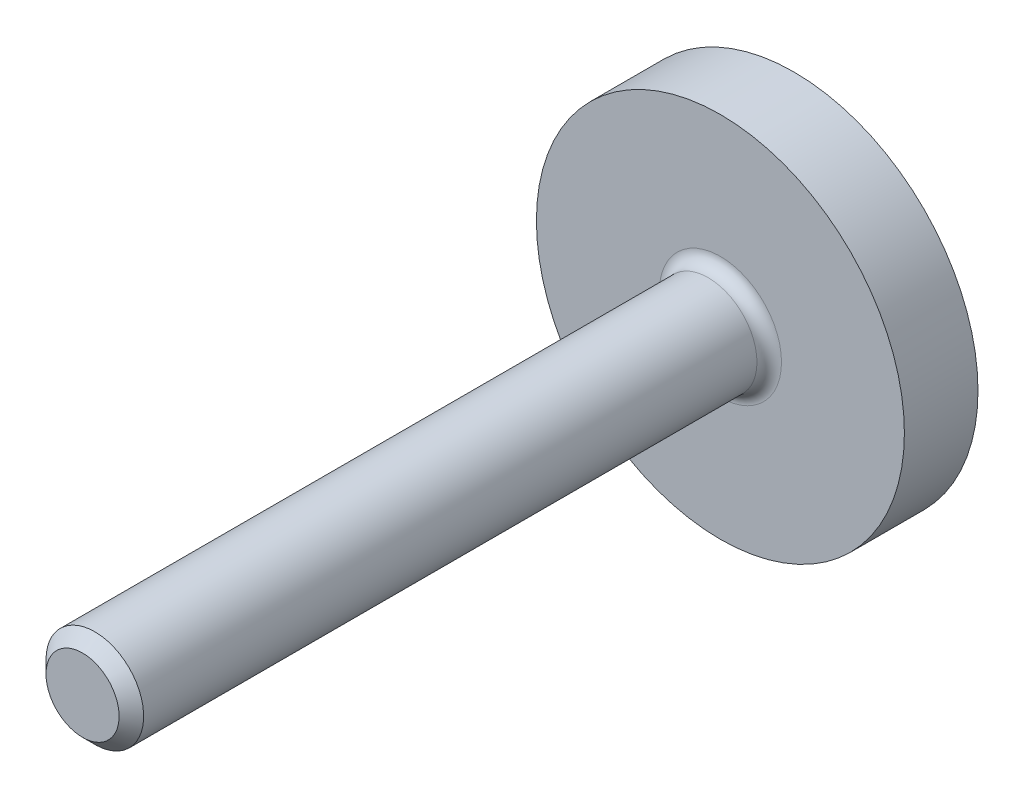
ISO-10303-21;
HEADER;
FILE_DESCRIPTION(('STEP AP214'),'2;1');
FILE_NAME('part.step','',(''),(''),'','','');
FILE_SCHEMA(('AUTOMOTIVE_DESIGN { 1 0 10303 214 1 1 1 1 }'));
ENDSEC;
DATA;
#1=APPLICATION_CONTEXT('core data for automotive mechanical design processes');
#2=APPLICATION_PROTOCOL_DEFINITION('international standard','automotive_design',2000,#1);
#3=PRODUCT_CONTEXT('',#1,'mechanical');
#4=PRODUCT('Part','Part','',(#3));
#5=PRODUCT_RELATED_PRODUCT_CATEGORY('part','',(#4));
#6=PRODUCT_DEFINITION_FORMATION('','',#4);
#7=PRODUCT_DEFINITION_CONTEXT('part definition',#1,'design');
#8=PRODUCT_DEFINITION('design','',#6,#7);
#9=PRODUCT_DEFINITION_SHAPE('','',#8);
#10=(LENGTH_UNIT() NAMED_UNIT(*) SI_UNIT(.MILLI.,.METRE.));
#11=(NAMED_UNIT(*) PLANE_ANGLE_UNIT() SI_UNIT($,.RADIAN.));
#12=(NAMED_UNIT(*) SI_UNIT($,.STERADIAN.) SOLID_ANGLE_UNIT());
#13=UNCERTAINTY_MEASURE_WITH_UNIT(LENGTH_MEASURE(1.E-05),#10,'distance_accuracy_value','');
#14=(GEOMETRIC_REPRESENTATION_CONTEXT(3) GLOBAL_UNCERTAINTY_ASSIGNED_CONTEXT((#13)) GLOBAL_UNIT_ASSIGNED_CONTEXT((#10,
#11,#12)) REPRESENTATION_CONTEXT('',''));
#15=CARTESIAN_POINT('',(0.,0.,0.));
#16=DIRECTION('',(0.,0.,1.));
#17=DIRECTION('',(1.,0.,0.));
#18=AXIS2_PLACEMENT_3D('',#15,#16,#17);
#19=CARTESIAN_POINT('',(0.,0.,3.));
#20=DIRECTION('',(0.,0.,-1.));
#21=DIRECTION('',(-1.,0.,0.));
#22=AXIS2_PLACEMENT_3D('',#19,#20,#21);
#23=CYLINDRICAL_SURFACE('',#22,7.5);
#24=CARTESIAN_POINT('',(0.,0.,3.));
#25=DIRECTION('',(0.,0.,1.));
#26=DIRECTION('',(1.,0.,0.));
#27=AXIS2_PLACEMENT_3D('',#24,#25,#26);
#28=CIRCLE('',#27,7.5);
#29=CARTESIAN_POINT('',(7.5,0.,3.));
#30=VERTEX_POINT('',#29);
#31=EDGE_CURVE('E50',#30,#30,#28,.T.);
#32=ORIENTED_EDGE('',*,*,#31,.F.);
#33=EDGE_LOOP('',(#32));
#34=FACE_BOUND('',#33,.T.);
#35=CARTESIAN_POINT('',(0.,0.,0.));
#36=DIRECTION('',(0.,0.,1.));
#37=DIRECTION('',(1.,0.,0.));
#38=AXIS2_PLACEMENT_3D('',#35,#36,#37);
#39=CIRCLE('',#38,7.5);
#40=CARTESIAN_POINT('',(7.5,0.,0.));
#41=VERTEX_POINT('',#40);
#42=EDGE_CURVE('E51',#41,#41,#39,.T.);
#43=ORIENTED_EDGE('',*,*,#42,.T.);
#44=EDGE_LOOP('',(#43));
#45=FACE_BOUND('',#44,.T.);
#46=ADVANCED_FACE('F30',(#34,#45),#23,.T.);
#47=CARTESIAN_POINT('',(0.,0.,3.));
#48=DIRECTION('',(0.,0.,1.));
#49=DIRECTION('',(1.,0.,0.));
#50=AXIS2_PLACEMENT_3D('',#47,#48,#49);
#51=PLANE('',#50);
#52=CARTESIAN_POINT('',(0.,0.,3.));
#53=DIRECTION('',(0.,0.,1.));
#54=DIRECTION('',(1.,0.,0.));
#55=AXIS2_PLACEMENT_3D('',#52,#53,#54);
#56=CIRCLE('',#55,2.49);
#57=CARTESIAN_POINT('',(2.49,0.,3.));
#58=VERTEX_POINT('',#57);
#59=EDGE_CURVE('E10',#58,#58,#56,.F.);
#60=ORIENTED_EDGE('',*,*,#59,.T.);
#61=EDGE_LOOP('',(#60));
#62=FACE_BOUND('',#61,.T.);
#63=ORIENTED_EDGE('',*,*,#31,.T.);
#64=EDGE_LOOP('',(#63));
#65=FACE_BOUND('',#64,.T.);
#66=ADVANCED_FACE('F57',(#62,#65),#51,.T.);
#67=CARTESIAN_POINT('',(0.,0.,0.));
#68=DIRECTION('',(0.,0.,1.));
#69=DIRECTION('',(1.,0.,0.));
#70=AXIS2_PLACEMENT_3D('',#67,#68,#69);
#71=PLANE('',#70);
#72=ORIENTED_EDGE('',*,*,#42,.F.);
#73=EDGE_LOOP('',(#72));
#74=FACE_BOUND('',#73,.T.);
#75=ADVANCED_FACE('F64',(#74),#71,.F.);
#76=CARTESIAN_POINT('',(0.,0.,29.));
#77=DIRECTION('',(0.,0.,-1.));
#78=DIRECTION('',(-1.,0.,0.));
#79=AXIS2_PLACEMENT_3D('',#76,#77,#78);
#80=CYLINDRICAL_SURFACE('',#79,1.99);
#81=CARTESIAN_POINT('',(0.,0.,3.5));
#82=DIRECTION('',(0.,0.,1.));
#83=DIRECTION('',(1.,0.,0.));
#84=AXIS2_PLACEMENT_3D('',#81,#82,#83);
#85=CIRCLE('',#84,1.99);
#86=CARTESIAN_POINT('',(-1.99,0.,3.5));
#87=VERTEX_POINT('',#86);
#88=EDGE_CURVE('E37',#87,#87,#85,.T.);
#89=CARTESIAN_POINT('',(0.,0.,28.5));
#90=DIRECTION('',(0.,0.,1.));
#91=DIRECTION('',(1.,0.,0.));
#92=AXIS2_PLACEMENT_3D('',#89,#90,#91);
#93=CIRCLE('',#92,1.99);
#94=CARTESIAN_POINT('',(-1.99,0.,28.5));
#95=VERTEX_POINT('',#94);
#96=EDGE_CURVE('E41',#95,#95,#93,.F.);
#97=CARTESIAN_POINT('',(-1.99,0.,3.5));
#98=CARTESIAN_POINT('',(-1.99,0.,3.76041666666667));
#99=CARTESIAN_POINT('',(-1.99,0.,4.02083333333333));
#100=CARTESIAN_POINT('',(-1.99,0.,4.54166666666667));
#101=CARTESIAN_POINT('',(-1.99,0.,4.80208333333333));
#102=CARTESIAN_POINT('',(-1.99,0.,5.32291666666667));
#103=CARTESIAN_POINT('',(-1.99,0.,5.58333333333333));
#104=CARTESIAN_POINT('',(-1.99,0.,6.10416666666667));
#105=CARTESIAN_POINT('',(-1.99,0.,6.36458333333334));
#106=CARTESIAN_POINT('',(-1.99,0.,6.88541666666667));
#107=CARTESIAN_POINT('',(-1.99,0.,7.14583333333333));
#108=CARTESIAN_POINT('',(-1.99,0.,7.66666666666667));
#109=CARTESIAN_POINT('',(-1.99,0.,7.92708333333333));
#110=CARTESIAN_POINT('',(-1.99,0.,8.44791666666667));
#111=CARTESIAN_POINT('',(-1.99,0.,8.70833333333333));
#112=CARTESIAN_POINT('',(-1.99,0.,9.22916666666667));
#113=CARTESIAN_POINT('',(-1.99,0.,9.48958333333333));
#114=CARTESIAN_POINT('',(-1.99,0.,10.0104166666667));
#115=CARTESIAN_POINT('',(-1.99,0.,10.2708333333333));
#116=CARTESIAN_POINT('',(-1.99,0.,10.7916666666667));
#117=CARTESIAN_POINT('',(-1.99,0.,11.0520833333333));
#118=CARTESIAN_POINT('',(-1.99,0.,11.5729166666667));
#119=CARTESIAN_POINT('',(-1.99,0.,11.8333333333333));
#120=CARTESIAN_POINT('',(-1.99,0.,12.3541666666667));
#121=CARTESIAN_POINT('',(-1.99,0.,12.6145833333333));
#122=CARTESIAN_POINT('',(-1.99,0.,13.1354166666667));
#123=CARTESIAN_POINT('',(-1.99,0.,13.3958333333333));
#124=CARTESIAN_POINT('',(-1.99,0.,13.9166666666667));
#125=CARTESIAN_POINT('',(-1.99,0.,14.1770833333333));
#126=CARTESIAN_POINT('',(-1.99,0.,14.6979166666667));
#127=CARTESIAN_POINT('',(-1.99,0.,14.9583333333333));
#128=CARTESIAN_POINT('',(-1.99,0.,15.4791666666667));
#129=CARTESIAN_POINT('',(-1.99,0.,15.7395833333333));
#130=CARTESIAN_POINT('',(-1.99,0.,16.2604166666667));
#131=CARTESIAN_POINT('',(-1.99,0.,16.5208333333333));
#132=CARTESIAN_POINT('',(-1.99,0.,17.0416666666667));
#133=CARTESIAN_POINT('',(-1.99,0.,17.3020833333333));
#134=CARTESIAN_POINT('',(-1.99,0.,17.8229166666667));
#135=CARTESIAN_POINT('',(-1.99,0.,18.0833333333333));
#136=CARTESIAN_POINT('',(-1.99,0.,18.6041666666667));
#137=CARTESIAN_POINT('',(-1.99,0.,18.8645833333333));
#138=CARTESIAN_POINT('',(-1.99,0.,19.3854166666667));
#139=CARTESIAN_POINT('',(-1.99,0.,19.6458333333333));
#140=CARTESIAN_POINT('',(-1.99,0.,20.1666666666667));
#141=CARTESIAN_POINT('',(-1.99,0.,20.4270833333333));
#142=CARTESIAN_POINT('',(-1.99,0.,20.9479166666667));
#143=CARTESIAN_POINT('',(-1.99,0.,21.2083333333333));
#144=CARTESIAN_POINT('',(-1.99,0.,21.7291666666667));
#145=CARTESIAN_POINT('',(-1.99,0.,21.9895833333333));
#146=CARTESIAN_POINT('',(-1.99,0.,22.5104166666667));
#147=CARTESIAN_POINT('',(-1.99,0.,22.7708333333333));
#148=CARTESIAN_POINT('',(-1.99,0.,23.2916666666667));
#149=CARTESIAN_POINT('',(-1.99,0.,23.5520833333333));
#150=CARTESIAN_POINT('',(-1.99,0.,24.0729166666667));
#151=CARTESIAN_POINT('',(-1.99,0.,24.3333333333333));
#152=CARTESIAN_POINT('',(-1.99,0.,24.8541666666667));
#153=CARTESIAN_POINT('',(-1.99,0.,25.1145833333333));
#154=CARTESIAN_POINT('',(-1.99,0.,25.6354166666667));
#155=CARTESIAN_POINT('',(-1.99,0.,25.8958333333333));
#156=CARTESIAN_POINT('',(-1.99,0.,26.4166666666667));
#157=CARTESIAN_POINT('',(-1.99,0.,26.6770833333333));
#158=CARTESIAN_POINT('',(-1.99,0.,27.1979166666667));
#159=CARTESIAN_POINT('',(-1.99,0.,27.4583333333333));
#160=CARTESIAN_POINT('',(-1.99,0.,27.9791666666667));
#161=CARTESIAN_POINT('',(-1.99,0.,28.2395833333333));
#162=CARTESIAN_POINT('',(-1.99,0.,28.5));
#163=B_SPLINE_CURVE_WITH_KNOTS('',3,(#97,#98,#99,#100,#101,#102,#103,#104,#105,#106,#107,#108,
#109,#110,#111,#112,#113,#114,#115,#116,#117,#118,#119,#120,#121,#122,#123,#124,#125,#126,#127,
#128,#129,#130,#131,#132,#133,#134,#135,#136,#137,#138,#139,#140,#141,#142,#143,#144,#145,#146,
#147,#148,#149,#150,#151,#152,#153,#154,#155,#156,#157,#158,#159,#160,#161,#162),.UNSPECIFIED.,
.F.,.F.,(4,2,2,2,2,2,2,2,2,2,2,2,2,2,2,2,2,2,2,2,2,2,2,2,2,2,2,2,2,2,2,2,4),(0.,
0.781250000000001,1.5625,2.34375,3.125,3.90625,4.6875,5.46875,6.25,7.03125,7.8125,8.59375,9.375,
10.15625,10.9375,11.71875,12.5,13.28125,14.0625,14.84375,15.625,16.40625,17.1875,17.96875,18.75,
19.53125,20.3125,21.09375,21.875,22.65625,23.4375,24.21875,25.),.UNSPECIFIED.);
#164=EDGE_CURVE('BSEAM66',#87,#95,#163,.T.);
#165=ORIENTED_EDGE('',*,*,#88,.T.);
#166=ORIENTED_EDGE('',*,*,#96,.T.);
#167=ORIENTED_EDGE('',*,*,#164,.T.);
#168=ORIENTED_EDGE('',*,*,#164,.F.);
#169=EDGE_LOOP('',(#165,#167,#166,#168));
#170=FACE_BOUND('',#169,.T.);
#171=ADVANCED_FACE('F66',(#170),#80,.T.);
#172=CARTESIAN_POINT('',(0.,0.,29.));
#173=DIRECTION('',(0.,0.,1.));
#174=DIRECTION('',(1.,0.,0.));
#175=AXIS2_PLACEMENT_3D('',#172,#173,#174);
#176=PLANE('',#175);
#177=CARTESIAN_POINT('',(0.,0.,29.));
#178=DIRECTION('',(0.,0.,1.));
#179=DIRECTION('',(1.,0.,0.));
#180=AXIS2_PLACEMENT_3D('',#177,#178,#179);
#181=CIRCLE('',#180,1.49000000000001);
#182=CARTESIAN_POINT('',(1.49000000000001,0.,29.));
#183=VERTEX_POINT('',#182);
#184=EDGE_CURVE('E45',#183,#183,#181,.T.);
#185=ORIENTED_EDGE('',*,*,#184,.T.);
#186=EDGE_LOOP('',(#185));
#187=FACE_BOUND('',#186,.T.);
#188=ADVANCED_FACE('F72',(#187),#176,.T.);
#189=CARTESIAN_POINT('',(0.,0.,29.));
#190=DIRECTION('',(0.,0.,-1.));
#191=DIRECTION('',(-1.,0.,0.));
#192=AXIS2_PLACEMENT_3D('',#189,#190,#191);
#193=CONICAL_SURFACE('',#192,1.49000000000001,0.785398163397447);
#194=ORIENTED_EDGE('',*,*,#96,.F.);
#195=EDGE_LOOP('',(#194));
#196=FACE_BOUND('',#195,.T.);
#197=ORIENTED_EDGE('',*,*,#184,.F.);
#198=EDGE_LOOP('',(#197));
#199=FACE_BOUND('',#198,.T.);
#200=ADVANCED_FACE('F75',(#196,#199),#193,.T.);
#201=CARTESIAN_POINT('',(0.,0.,3.5));
#202=DIRECTION('',(0.,0.,1.));
#203=DIRECTION('',(1.,0.,0.));
#204=AXIS2_PLACEMENT_3D('',#201,#202,#203);
#205=TOROIDAL_SURFACE('',#204,2.49,0.5);
#206=ORIENTED_EDGE('',*,*,#59,.F.);
#207=EDGE_LOOP('',(#206));
#208=FACE_BOUND('',#207,.T.);
#209=ORIENTED_EDGE('',*,*,#88,.F.);
#210=EDGE_LOOP('',(#209));
#211=FACE_BOUND('',#210,.T.);
#212=ADVANCED_FACE('F32',(#208,#211),#205,.F.);
#213=CLOSED_SHELL('',(#46,#66,#75,#171,#188,#200,#212));
#214=MANIFOLD_SOLID_BREP('B2',#213);
#215=ADVANCED_BREP_SHAPE_REPRESENTATION('',(#18,#214),#14);
#216=SHAPE_DEFINITION_REPRESENTATION(#9,#215);
ENDSEC;
END-ISO-10303-21;
